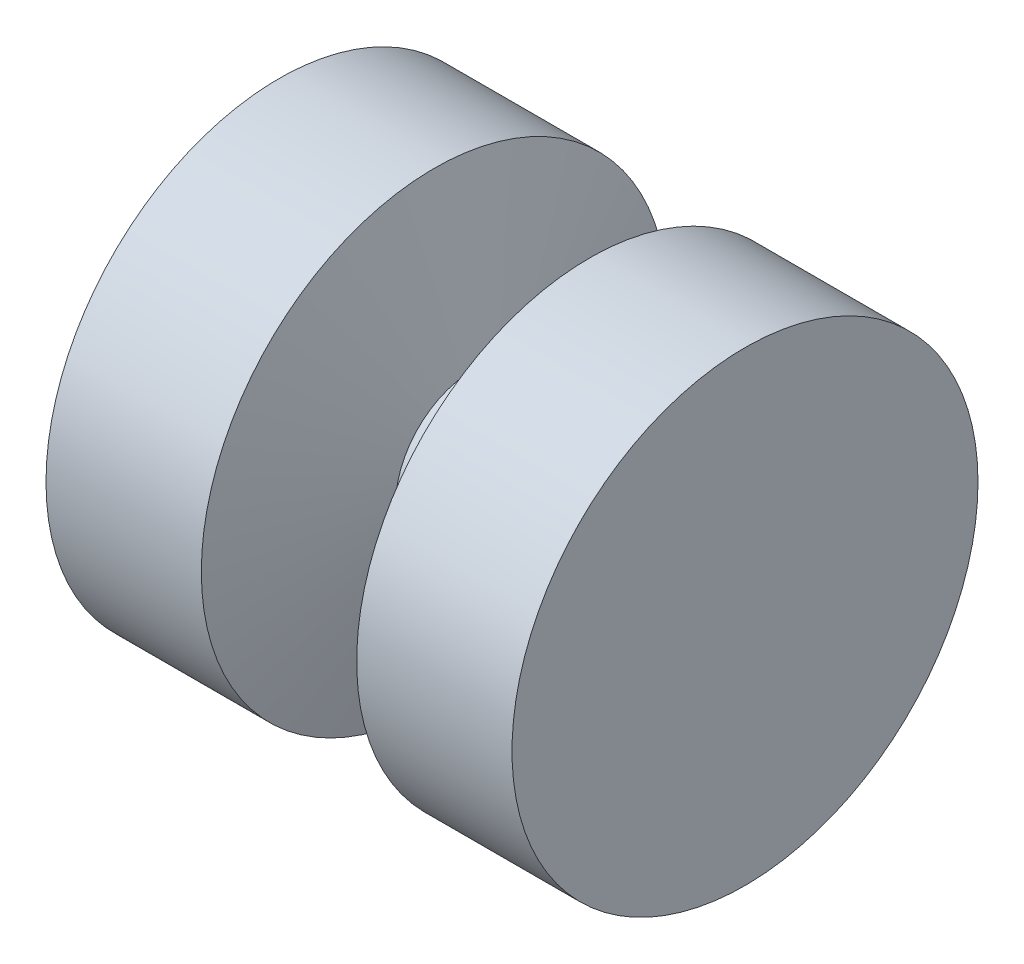
ISO-10303-21;
HEADER;
FILE_DESCRIPTION(('STEP AP214'),'2;1');
FILE_NAME('part.step','',(''),(''),'','','');
FILE_SCHEMA(('AUTOMOTIVE_DESIGN { 1 0 10303 214 1 1 1 1 }'));
ENDSEC;
DATA;
#1=APPLICATION_CONTEXT('core data for automotive mechanical design processes');
#2=APPLICATION_PROTOCOL_DEFINITION('international standard','automotive_design',2000,#1);
#3=PRODUCT_CONTEXT('',#1,'mechanical');
#4=PRODUCT('Part','Part','',(#3));
#5=PRODUCT_RELATED_PRODUCT_CATEGORY('part','',(#4));
#6=PRODUCT_DEFINITION_FORMATION('','',#4);
#7=PRODUCT_DEFINITION_CONTEXT('part definition',#1,'design');
#8=PRODUCT_DEFINITION('design','',#6,#7);
#9=PRODUCT_DEFINITION_SHAPE('','',#8);
#10=(LENGTH_UNIT() NAMED_UNIT(*) SI_UNIT(.MILLI.,.METRE.));
#11=(NAMED_UNIT(*) PLANE_ANGLE_UNIT() SI_UNIT($,.RADIAN.));
#12=(NAMED_UNIT(*) SI_UNIT($,.STERADIAN.) SOLID_ANGLE_UNIT());
#13=UNCERTAINTY_MEASURE_WITH_UNIT(LENGTH_MEASURE(1.E-05),#10,'distance_accuracy_value','');
#14=(GEOMETRIC_REPRESENTATION_CONTEXT(3) GLOBAL_UNCERTAINTY_ASSIGNED_CONTEXT((#13)) GLOBAL_UNIT_ASSIGNED_CONTEXT((#10,
#11,#12)) REPRESENTATION_CONTEXT('',''));
#15=CARTESIAN_POINT('',(0.,0.,0.));
#16=DIRECTION('',(0.,0.,1.));
#17=DIRECTION('',(1.,0.,0.));
#18=AXIS2_PLACEMENT_3D('',#15,#16,#17);
#19=CARTESIAN_POINT('',(15.,0.,0.));
#20=DIRECTION('',(-1.,0.,0.));
#21=DIRECTION('',(0.,0.,1.));
#22=AXIS2_PLACEMENT_3D('',#19,#20,#21);
#23=CYLINDRICAL_SURFACE('',#22,15.);
#24=CARTESIAN_POINT('',(-5.,0.,0.));
#25=DIRECTION('',(-1.,0.,0.));
#26=DIRECTION('',(0.,0.,1.));
#27=AXIS2_PLACEMENT_3D('',#24,#25,#26);
#28=CIRCLE('',#27,15.);
#29=CARTESIAN_POINT('',(-5.,0.,15.));
#30=VERTEX_POINT('',#29);
#31=EDGE_CURVE('E48',#30,#30,#28,.T.);
#32=ORIENTED_EDGE('',*,*,#31,.T.);
#33=EDGE_LOOP('',(#32));
#34=FACE_BOUND('',#33,.T.);
#35=CARTESIAN_POINT('',(-15.,0.,0.));
#36=DIRECTION('',(1.,0.,0.));
#37=DIRECTION('',(0.,0.,-1.));
#38=AXIS2_PLACEMENT_3D('',#35,#36,#37);
#39=CIRCLE('',#38,15.);
#40=CARTESIAN_POINT('',(-15.,0.,-15.));
#41=VERTEX_POINT('',#40);
#42=EDGE_CURVE('E41',#41,#41,#39,.T.);
#43=ORIENTED_EDGE('',*,*,#42,.T.);
#44=EDGE_LOOP('',(#43));
#45=FACE_BOUND('',#44,.T.);
#46=ADVANCED_FACE('F37',(#34,#45),#23,.T.);
#47=CARTESIAN_POINT('',(-15.,0.,0.));
#48=DIRECTION('',(1.,0.,0.));
#49=DIRECTION('',(0.,0.,-1.));
#50=AXIS2_PLACEMENT_3D('',#47,#48,#49);
#51=PLANE('',#50);
#52=ORIENTED_EDGE('',*,*,#42,.F.);
#53=EDGE_LOOP('',(#52));
#54=FACE_BOUND('',#53,.T.);
#55=ADVANCED_FACE('F72',(#54),#51,.F.);
#56=CARTESIAN_POINT('',(-2.49999999999999,0.,0.));
#57=DIRECTION('',(-1.,0.,0.));
#58=DIRECTION('',(0.,0.,1.));
#59=AXIS2_PLACEMENT_3D('',#56,#57,#58);
#60=CONICAL_SURFACE('',#59,5.,1.32581766366803);
#61=CARTESIAN_POINT('',(-2.49999999999999,0.,0.));
#62=DIRECTION('',(-1.,0.,0.));
#63=DIRECTION('',(0.,0.,1.));
#64=AXIS2_PLACEMENT_3D('',#61,#62,#63);
#65=CIRCLE('',#64,5.);
#66=CARTESIAN_POINT('',(-2.49999999999999,0.,5.));
#67=VERTEX_POINT('',#66);
#68=EDGE_CURVE('E52',#67,#67,#65,.T.);
#69=CARTESIAN_POINT('',(-5.,0.,15.));
#70=CARTESIAN_POINT('',(-4.97395833333333,0.,14.8958333333333));
#71=CARTESIAN_POINT('',(-4.94791666666667,0.,14.7916666666667));
#72=CARTESIAN_POINT('',(-4.89583333333333,0.,14.5833333333333));
#73=CARTESIAN_POINT('',(-4.86979166666667,0.,14.4791666666667));
#74=CARTESIAN_POINT('',(-4.81770833333333,0.,14.2708333333333));
#75=CARTESIAN_POINT('',(-4.79166666666667,0.,14.1666666666667));
#76=CARTESIAN_POINT('',(-4.73958333333333,0.,13.9583333333333));
#77=CARTESIAN_POINT('',(-4.71354166666667,0.,13.8541666666667));
#78=CARTESIAN_POINT('',(-4.66145833333333,0.,13.6458333333333));
#79=CARTESIAN_POINT('',(-4.63541666666667,0.,13.5416666666667));
#80=CARTESIAN_POINT('',(-4.58333333333333,0.,13.3333333333333));
#81=CARTESIAN_POINT('',(-4.55729166666667,0.,13.2291666666667));
#82=CARTESIAN_POINT('',(-4.50520833333333,0.,13.0208333333333));
#83=CARTESIAN_POINT('',(-4.47916666666667,0.,12.9166666666667));
#84=CARTESIAN_POINT('',(-4.42708333333333,0.,12.7083333333333));
#85=CARTESIAN_POINT('',(-4.40104166666667,0.,12.6041666666667));
#86=CARTESIAN_POINT('',(-4.34895833333333,0.,12.3958333333333));
#87=CARTESIAN_POINT('',(-4.32291666666666,0.,12.2916666666667));
#88=CARTESIAN_POINT('',(-4.27083333333333,0.,12.0833333333333));
#89=CARTESIAN_POINT('',(-4.24479166666666,0.,11.9791666666667));
#90=CARTESIAN_POINT('',(-4.19270833333333,0.,11.7708333333333));
#91=CARTESIAN_POINT('',(-4.16666666666666,0.,11.6666666666667));
#92=CARTESIAN_POINT('',(-4.11458333333333,0.,11.4583333333333));
#93=CARTESIAN_POINT('',(-4.08854166666666,0.,11.3541666666667));
#94=CARTESIAN_POINT('',(-4.03645833333333,0.,11.1458333333333));
#95=CARTESIAN_POINT('',(-4.01041666666666,0.,11.0416666666667));
#96=CARTESIAN_POINT('',(-3.95833333333333,0.,10.8333333333333));
#97=CARTESIAN_POINT('',(-3.93229166666666,0.,10.7291666666667));
#98=CARTESIAN_POINT('',(-3.88020833333333,0.,10.5208333333333));
#99=CARTESIAN_POINT('',(-3.85416666666666,0.,10.4166666666667));
#100=CARTESIAN_POINT('',(-3.80208333333333,0.,10.2083333333333));
#101=CARTESIAN_POINT('',(-3.77604166666666,0.,10.1041666666667));
#102=CARTESIAN_POINT('',(-3.72395833333333,0.,9.89583333333333));
#103=CARTESIAN_POINT('',(-3.69791666666666,0.,9.79166666666667));
#104=CARTESIAN_POINT('',(-3.64583333333333,0.,9.58333333333333));
#105=CARTESIAN_POINT('',(-3.61979166666666,0.,9.47916666666667));
#106=CARTESIAN_POINT('',(-3.56770833333333,0.,9.27083333333333));
#107=CARTESIAN_POINT('',(-3.54166666666666,0.,9.16666666666666));
#108=CARTESIAN_POINT('',(-3.48958333333333,0.,8.95833333333333));
#109=CARTESIAN_POINT('',(-3.46354166666666,0.,8.85416666666666));
#110=CARTESIAN_POINT('',(-3.41145833333333,0.,8.64583333333333));
#111=CARTESIAN_POINT('',(-3.38541666666666,0.,8.54166666666666));
#112=CARTESIAN_POINT('',(-3.33333333333333,0.,8.33333333333333));
#113=CARTESIAN_POINT('',(-3.30729166666666,0.,8.22916666666667));
#114=CARTESIAN_POINT('',(-3.25520833333333,0.,8.02083333333333));
#115=CARTESIAN_POINT('',(-3.22916666666666,0.,7.91666666666667));
#116=CARTESIAN_POINT('',(-3.17708333333333,0.,7.70833333333333));
#117=CARTESIAN_POINT('',(-3.15104166666666,0.,7.60416666666667));
#118=CARTESIAN_POINT('',(-3.09895833333333,0.,7.39583333333333));
#119=CARTESIAN_POINT('',(-3.07291666666666,0.,7.29166666666667));
#120=CARTESIAN_POINT('',(-3.02083333333333,0.,7.08333333333333));
#121=CARTESIAN_POINT('',(-2.99479166666666,0.,6.97916666666667));
#122=CARTESIAN_POINT('',(-2.94270833333333,0.,6.77083333333333));
#123=CARTESIAN_POINT('',(-2.91666666666666,0.,6.66666666666667));
#124=CARTESIAN_POINT('',(-2.86458333333333,0.,6.45833333333333));
#125=CARTESIAN_POINT('',(-2.83854166666666,0.,6.35416666666667));
#126=CARTESIAN_POINT('',(-2.78645833333333,0.,6.14583333333333));
#127=CARTESIAN_POINT('',(-2.76041666666666,0.,6.04166666666667));
#128=CARTESIAN_POINT('',(-2.70833333333333,0.,5.83333333333333));
#129=CARTESIAN_POINT('',(-2.68229166666666,0.,5.72916666666666));
#130=CARTESIAN_POINT('',(-2.63020833333333,0.,5.52083333333333));
#131=CARTESIAN_POINT('',(-2.60416666666666,0.,5.41666666666666));
#132=CARTESIAN_POINT('',(-2.55208333333332,0.,5.20833333333333));
#133=CARTESIAN_POINT('',(-2.52604166666666,0.,5.10416666666667));
#134=CARTESIAN_POINT('',(-2.49999999999999,0.,5.));
#135=B_SPLINE_CURVE_WITH_KNOTS('',3,(#69,#70,#71,#72,#73,#74,#75,#76,#77,#78,#79,#80,#81,#82,
#83,#84,#85,#86,#87,#88,#89,#90,#91,#92,#93,#94,#95,#96,#97,#98,#99,#100,#101,#102,#103,#104,
#105,#106,#107,#108,#109,#110,#111,#112,#113,#114,#115,#116,#117,#118,#119,#120,#121,#122,#123,
#124,#125,#126,#127,#128,#129,#130,#131,#132,#133,#134),.UNSPECIFIED.,.F.,.F.,(4,2,2,2,2,2,2,2,
2,2,2,2,2,2,2,2,2,2,2,2,2,2,2,2,2,2,2,2,2,2,2,2,4),(0.,0.32211762700138,0.64423525400276,
0.96635288100414,1.28847050800552,1.6105881350069,1.93270576200828,2.25482338900966,
2.57694101601104,2.89905864301242,3.2211762700138,3.54329389701518,3.86541152401656,
4.18752915101794,4.50964677801932,4.8317644050207,5.15388203202208,5.47599965902346,
5.79811728602484,6.12023491302622,6.4423525400276,6.76447016702898,7.08658779403036,
7.40870542103174,7.73082304803311,8.0529406750345,8.37505830203587,8.69717592903726,
9.01929355603863,9.34141118304002,9.6635288100414,9.98564643704278,10.3077640640442),.UNSPECIFIED.);
#136=EDGE_CURVE('BSEAM77',#30,#67,#135,.T.);
#137=ORIENTED_EDGE('',*,*,#31,.F.);
#138=ORIENTED_EDGE('',*,*,#68,.T.);
#139=ORIENTED_EDGE('',*,*,#136,.T.);
#140=ORIENTED_EDGE('',*,*,#136,.F.);
#141=EDGE_LOOP('',(#137,#139,#138,#140));
#142=FACE_BOUND('',#141,.T.);
#143=ADVANCED_FACE('F77',(#142),#60,.T.);
#144=CARTESIAN_POINT('',(0.,0.,0.));
#145=DIRECTION('',(-1.,0.,0.));
#146=DIRECTION('',(0.,0.,1.));
#147=AXIS2_PLACEMENT_3D('',#144,#145,#146);
#148=CYLINDRICAL_SURFACE('',#147,5.);
#149=ORIENTED_EDGE('',*,*,#68,.F.);
#150=EDGE_LOOP('',(#149));
#151=FACE_BOUND('',#150,.T.);
#152=CARTESIAN_POINT('',(2.50000000000001,0.,0.));
#153=DIRECTION('',(-1.,0.,0.));
#154=DIRECTION('',(0.,0.,1.));
#155=AXIS2_PLACEMENT_3D('',#152,#153,#154);
#156=CIRCLE('',#155,5.);
#157=CARTESIAN_POINT('',(2.50000000000001,0.,-5.00000000000001));
#158=VERTEX_POINT('',#157);
#159=EDGE_CURVE('E55',#158,#158,#156,.T.);
#160=ORIENTED_EDGE('',*,*,#159,.T.);
#161=EDGE_LOOP('',(#160));
#162=FACE_BOUND('',#161,.T.);
#163=ADVANCED_FACE('F85',(#151,#162),#148,.T.);
#164=CARTESIAN_POINT('',(5.,0.,0.));
#165=DIRECTION('',(1.,0.,0.));
#166=DIRECTION('',(0.,0.,-1.));
#167=AXIS2_PLACEMENT_3D('',#164,#165,#166);
#168=CONICAL_SURFACE('',#167,15.,1.32581766366803);
#169=CARTESIAN_POINT('',(5.,0.,0.));
#170=DIRECTION('',(-1.,0.,0.));
#171=DIRECTION('',(0.,0.,1.));
#172=AXIS2_PLACEMENT_3D('',#169,#170,#171);
#173=CIRCLE('',#172,15.);
#174=CARTESIAN_POINT('',(5.,0.,-15.));
#175=VERTEX_POINT('',#174);
#176=EDGE_CURVE('E58',#175,#175,#173,.T.);
#177=CARTESIAN_POINT('',(2.50000000000001,0.,-5.00000000000001));
#178=CARTESIAN_POINT('',(2.52604166666668,0.,-5.10416666666667));
#179=CARTESIAN_POINT('',(2.55208333333334,0.,-5.20833333333334));
#180=CARTESIAN_POINT('',(2.60416666666668,0.,-5.41666666666667));
#181=CARTESIAN_POINT('',(2.63020833333334,0.,-5.52083333333334));
#182=CARTESIAN_POINT('',(2.68229166666668,0.,-5.72916666666667));
#183=CARTESIAN_POINT('',(2.70833333333334,0.,-5.83333333333334));
#184=CARTESIAN_POINT('',(2.76041666666667,0.,-6.04166666666667));
#185=CARTESIAN_POINT('',(2.78645833333334,0.,-6.14583333333334));
#186=CARTESIAN_POINT('',(2.83854166666667,0.,-6.35416666666667));
#187=CARTESIAN_POINT('',(2.86458333333334,0.,-6.45833333333334));
#188=CARTESIAN_POINT('',(2.91666666666667,0.,-6.66666666666667));
#189=CARTESIAN_POINT('',(2.94270833333334,0.,-6.77083333333334));
#190=CARTESIAN_POINT('',(2.99479166666667,0.,-6.97916666666667));
#191=CARTESIAN_POINT('',(3.02083333333334,0.,-7.08333333333334));
#192=CARTESIAN_POINT('',(3.07291666666667,0.,-7.29166666666667));
#193=CARTESIAN_POINT('',(3.09895833333334,0.,-7.39583333333334));
#194=CARTESIAN_POINT('',(3.15104166666667,0.,-7.60416666666667));
#195=CARTESIAN_POINT('',(3.17708333333334,0.,-7.70833333333334));
#196=CARTESIAN_POINT('',(3.22916666666667,0.,-7.91666666666667));
#197=CARTESIAN_POINT('',(3.25520833333334,0.,-8.02083333333334));
#198=CARTESIAN_POINT('',(3.30729166666667,0.,-8.22916666666667));
#199=CARTESIAN_POINT('',(3.33333333333334,0.,-8.33333333333334));
#200=CARTESIAN_POINT('',(3.38541666666667,0.,-8.54166666666667));
#201=CARTESIAN_POINT('',(3.41145833333334,0.,-8.64583333333334));
#202=CARTESIAN_POINT('',(3.46354166666667,0.,-8.85416666666667));
#203=CARTESIAN_POINT('',(3.48958333333334,0.,-8.95833333333334));
#204=CARTESIAN_POINT('',(3.54166666666667,0.,-9.16666666666667));
#205=CARTESIAN_POINT('',(3.56770833333334,0.,-9.27083333333334));
#206=CARTESIAN_POINT('',(3.61979166666667,0.,-9.47916666666667));
#207=CARTESIAN_POINT('',(3.64583333333334,0.,-9.58333333333334));
#208=CARTESIAN_POINT('',(3.69791666666667,0.,-9.79166666666667));
#209=CARTESIAN_POINT('',(3.72395833333334,0.,-9.89583333333334));
#210=CARTESIAN_POINT('',(3.77604166666667,0.,-10.1041666666667));
#211=CARTESIAN_POINT('',(3.80208333333334,0.,-10.2083333333333));
#212=CARTESIAN_POINT('',(3.85416666666667,0.,-10.4166666666667));
#213=CARTESIAN_POINT('',(3.88020833333334,0.,-10.5208333333333));
#214=CARTESIAN_POINT('',(3.93229166666667,0.,-10.7291666666667));
#215=CARTESIAN_POINT('',(3.95833333333334,0.,-10.8333333333333));
#216=CARTESIAN_POINT('',(4.01041666666667,0.,-11.0416666666667));
#217=CARTESIAN_POINT('',(4.03645833333334,0.,-11.1458333333333));
#218=CARTESIAN_POINT('',(4.08854166666667,0.,-11.3541666666667));
#219=CARTESIAN_POINT('',(4.11458333333334,0.,-11.4583333333333));
#220=CARTESIAN_POINT('',(4.16666666666667,0.,-11.6666666666667));
#221=CARTESIAN_POINT('',(4.19270833333334,0.,-11.7708333333333));
#222=CARTESIAN_POINT('',(4.24479166666667,0.,-11.9791666666667));
#223=CARTESIAN_POINT('',(4.27083333333334,0.,-12.0833333333333));
#224=CARTESIAN_POINT('',(4.32291666666667,0.,-12.2916666666667));
#225=CARTESIAN_POINT('',(4.34895833333333,0.,-12.3958333333333));
#226=CARTESIAN_POINT('',(4.40104166666667,0.,-12.6041666666667));
#227=CARTESIAN_POINT('',(4.42708333333334,0.,-12.7083333333333));
#228=CARTESIAN_POINT('',(4.47916666666667,0.,-12.9166666666667));
#229=CARTESIAN_POINT('',(4.50520833333333,0.,-13.0208333333333));
#230=CARTESIAN_POINT('',(4.55729166666667,0.,-13.2291666666667));
#231=CARTESIAN_POINT('',(4.58333333333333,0.,-13.3333333333333));
#232=CARTESIAN_POINT('',(4.63541666666667,0.,-13.5416666666667));
#233=CARTESIAN_POINT('',(4.66145833333333,0.,-13.6458333333333));
#234=CARTESIAN_POINT('',(4.71354166666667,0.,-13.8541666666667));
#235=CARTESIAN_POINT('',(4.73958333333333,0.,-13.9583333333333));
#236=CARTESIAN_POINT('',(4.79166666666667,0.,-14.1666666666667));
#237=CARTESIAN_POINT('',(4.81770833333333,0.,-14.2708333333333));
#238=CARTESIAN_POINT('',(4.86979166666667,0.,-14.4791666666667));
#239=CARTESIAN_POINT('',(4.89583333333333,0.,-14.5833333333333));
#240=CARTESIAN_POINT('',(4.94791666666667,0.,-14.7916666666667));
#241=CARTESIAN_POINT('',(4.97395833333333,0.,-14.8958333333333));
#242=CARTESIAN_POINT('',(5.,0.,-15.));
#243=B_SPLINE_CURVE_WITH_KNOTS('',3,(#177,#178,#179,#180,#181,#182,#183,#184,#185,#186,#187,
#188,#189,#190,#191,#192,#193,#194,#195,#196,#197,#198,#199,#200,#201,#202,#203,#204,#205,#206,
#207,#208,#209,#210,#211,#212,#213,#214,#215,#216,#217,#218,#219,#220,#221,#222,#223,#224,#225,
#226,#227,#228,#229,#230,#231,#232,#233,#234,#235,#236,#237,#238,#239,#240,#241,#242),
.UNSPECIFIED.,.F.,.F.,(4,2,2,2,2,2,2,2,2,2,2,2,2,2,2,2,2,2,2,2,2,2,2,2,2,2,2,2,2,2,2,2,4),(0.,
0.32211762700138,0.644235254002758,0.96635288100414,1.28847050800552,1.6105881350069,
1.93270576200828,2.25482338900966,2.57694101601103,2.89905864301242,3.22117627001379,
3.54329389701517,3.86541152401655,4.18752915101793,4.50964677801931,4.83176440502069,
5.15388203202207,5.47599965902345,5.79811728602483,6.12023491302621,6.44235254002759,
6.76447016702897,7.08658779403035,7.40870542103173,7.73082304803311,8.05294067503449,
8.37505830203587,8.69717592903725,9.01929355603862,9.34141118304,9.66352881004138,
9.98564643704276,10.3077640640441),.UNSPECIFIED.);
#244=EDGE_CURVE('BSEAM62',#158,#175,#243,.T.);
#245=ORIENTED_EDGE('',*,*,#159,.F.);
#246=ORIENTED_EDGE('',*,*,#176,.T.);
#247=ORIENTED_EDGE('',*,*,#244,.T.);
#248=ORIENTED_EDGE('',*,*,#244,.F.);
#249=EDGE_LOOP('',(#245,#247,#246,#248));
#250=FACE_BOUND('',#249,.T.);
#251=ADVANCED_FACE('F62',(#250),#168,.T.);
#252=CARTESIAN_POINT('',(15.,0.,0.));
#253=DIRECTION('',(1.,0.,0.));
#254=DIRECTION('',(0.,0.,-1.));
#255=AXIS2_PLACEMENT_3D('',#252,#253,#254);
#256=PLANE('',#255);
#257=CARTESIAN_POINT('',(15.,0.,0.));
#258=DIRECTION('',(1.,0.,0.));
#259=DIRECTION('',(0.,0.,-1.));
#260=AXIS2_PLACEMENT_3D('',#257,#258,#259);
#261=CIRCLE('',#260,15.);
#262=CARTESIAN_POINT('',(15.,0.,-15.));
#263=VERTEX_POINT('',#262);
#264=EDGE_CURVE('E10',#263,#263,#261,.T.);
#265=ORIENTED_EDGE('',*,*,#264,.T.);
#266=EDGE_LOOP('',(#265));
#267=FACE_BOUND('',#266,.T.);
#268=ADVANCED_FACE('F66',(#267),#256,.T.);
#269=ORIENTED_EDGE('',*,*,#176,.F.);
#270=EDGE_LOOP('',(#269));
#271=FACE_BOUND('',#270,.T.);
#272=ORIENTED_EDGE('',*,*,#264,.F.);
#273=EDGE_LOOP('',(#272));
#274=FACE_BOUND('',#273,.T.);
#275=ADVANCED_FACE('F39',(#271,#274),#23,.T.);
#276=CLOSED_SHELL('',(#46,#55,#143,#163,#251,#268,#275));
#277=MANIFOLD_SOLID_BREP('B2',#276);
#278=ADVANCED_BREP_SHAPE_REPRESENTATION('',(#18,#277),#14);
#279=SHAPE_DEFINITION_REPRESENTATION(#9,#278);
ENDSEC;
END-ISO-10303-21;
